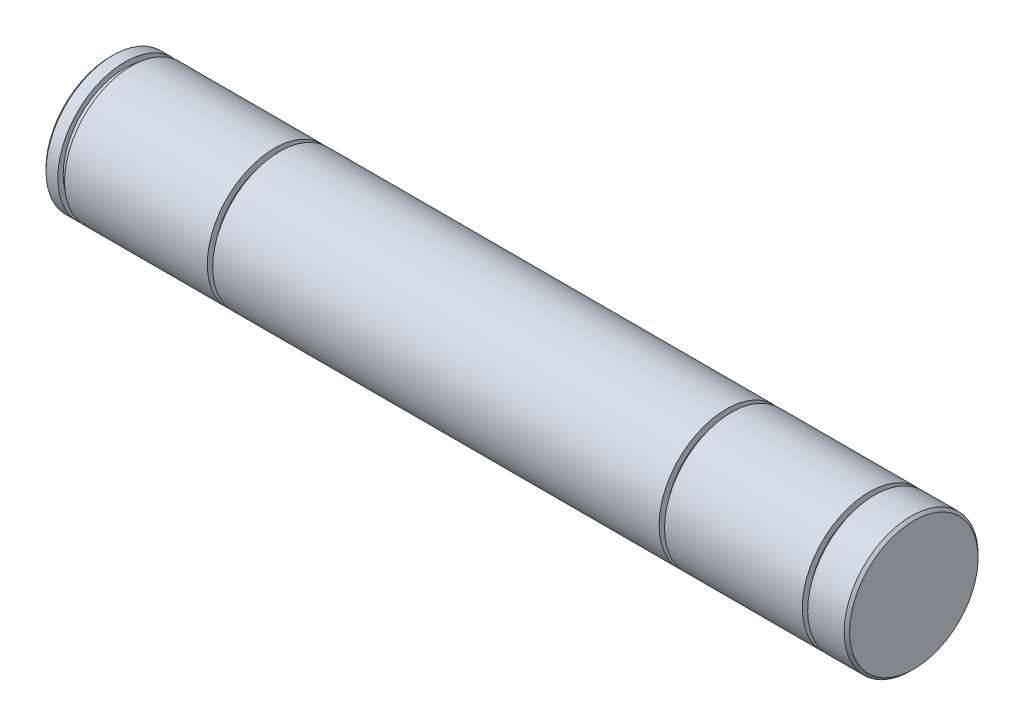
ISO-10303-21;
HEADER;
FILE_DESCRIPTION(('STEP AP214'),'2;1');
FILE_NAME('part.step','',(''),(''),'','','');
FILE_SCHEMA(('AUTOMOTIVE_DESIGN { 1 0 10303 214 1 1 1 1 }'));
ENDSEC;
DATA;
#1=APPLICATION_CONTEXT('core data for automotive mechanical design processes');
#2=APPLICATION_PROTOCOL_DEFINITION('international standard','automotive_design',2000,#1);
#3=PRODUCT_CONTEXT('',#1,'mechanical');
#4=PRODUCT('Part','Part','',(#3));
#5=PRODUCT_RELATED_PRODUCT_CATEGORY('part','',(#4));
#6=PRODUCT_DEFINITION_FORMATION('','',#4);
#7=PRODUCT_DEFINITION_CONTEXT('part definition',#1,'design');
#8=PRODUCT_DEFINITION('design','',#6,#7);
#9=PRODUCT_DEFINITION_SHAPE('','',#8);
#10=(LENGTH_UNIT() NAMED_UNIT(*) SI_UNIT(.MILLI.,.METRE.));
#11=(NAMED_UNIT(*) PLANE_ANGLE_UNIT() SI_UNIT($,.RADIAN.));
#12=(NAMED_UNIT(*) SI_UNIT($,.STERADIAN.) SOLID_ANGLE_UNIT());
#13=UNCERTAINTY_MEASURE_WITH_UNIT(LENGTH_MEASURE(1.E-05),#10,'distance_accuracy_value','');
#14=(GEOMETRIC_REPRESENTATION_CONTEXT(3) GLOBAL_UNCERTAINTY_ASSIGNED_CONTEXT((#13)) GLOBAL_UNIT_ASSIGNED_CONTEXT((#10,
#11,#12)) REPRESENTATION_CONTEXT('',''));
#15=CARTESIAN_POINT('',(0.,0.,0.));
#16=DIRECTION('',(0.,0.,1.));
#17=DIRECTION('',(1.,0.,0.));
#18=AXIS2_PLACEMENT_3D('',#15,#16,#17);
#19=CARTESIAN_POINT('',(0.,0.,0.));
#20=DIRECTION('',(1.,0.,0.));
#21=DIRECTION('',(0.,0.,-1.));
#22=AXIS2_PLACEMENT_3D('',#19,#20,#21);
#23=PLANE('',#22);
#24=CARTESIAN_POINT('',(0.,0.,0.));
#25=DIRECTION('',(-1.,0.,0.));
#26=DIRECTION('',(0.,0.,1.));
#27=AXIS2_PLACEMENT_3D('',#24,#25,#26);
#28=CIRCLE('',#27,24.);
#29=CARTESIAN_POINT('',(0.,0.,24.));
#30=VERTEX_POINT('',#29);
#31=EDGE_CURVE('E10',#30,#30,#28,.T.);
#32=ORIENTED_EDGE('',*,*,#31,.T.);
#33=EDGE_LOOP('',(#32));
#34=FACE_BOUND('',#33,.T.);
#35=ADVANCED_FACE('F37',(#34),#23,.F.);
#36=CARTESIAN_POINT('',(1.,0.,0.));
#37=DIRECTION('',(1.,0.,0.));
#38=DIRECTION('',(0.,0.,-1.));
#39=AXIS2_PLACEMENT_3D('',#36,#37,#38);
#40=CONICAL_SURFACE('',#39,25.,0.785398163397449);
#41=ORIENTED_EDGE('',*,*,#31,.F.);
#42=EDGE_LOOP('',(#41));
#43=FACE_BOUND('',#42,.T.);
#44=CARTESIAN_POINT('',(1.,0.,0.));
#45=DIRECTION('',(-1.,0.,0.));
#46=DIRECTION('',(0.,0.,1.));
#47=AXIS2_PLACEMENT_3D('',#44,#45,#46);
#48=CIRCLE('',#47,25.);
#49=CARTESIAN_POINT('',(1.,0.,25.));
#50=VERTEX_POINT('',#49);
#51=EDGE_CURVE('E43',#50,#50,#48,.T.);
#52=ORIENTED_EDGE('',*,*,#51,.T.);
#53=EDGE_LOOP('',(#52));
#54=FACE_BOUND('',#53,.T.);
#55=ADVANCED_FACE('F117',(#43,#54),#40,.T.);
#56=CARTESIAN_POINT('',(0.,0.,0.));
#57=DIRECTION('',(-1.,0.,0.));
#58=DIRECTION('',(0.,0.,1.));
#59=AXIS2_PLACEMENT_3D('',#56,#57,#58);
#60=CYLINDRICAL_SURFACE('',#59,25.);
#61=ORIENTED_EDGE('',*,*,#51,.F.);
#62=EDGE_LOOP('',(#61));
#63=FACE_BOUND('',#62,.T.);
#64=CARTESIAN_POINT('',(5.41464310345202,0.,0.));
#65=DIRECTION('',(-1.,0.,0.));
#66=DIRECTION('',(0.,0.,1.));
#67=AXIS2_PLACEMENT_3D('',#64,#65,#66);
#68=CIRCLE('',#67,25.);
#69=CARTESIAN_POINT('',(5.41464310345202,0.,25.));
#70=VERTEX_POINT('',#69);
#71=EDGE_CURVE('E47',#70,#70,#68,.T.);
#72=ORIENTED_EDGE('',*,*,#71,.T.);
#73=EDGE_LOOP('',(#72));
#74=FACE_BOUND('',#73,.T.);
#75=ADVANCED_FACE('F121',(#63,#74),#60,.T.);
#76=CARTESIAN_POINT('',(5.41464310345202,25.,0.));
#77=DIRECTION('',(-1.,0.,0.));
#78=DIRECTION('',(0.,0.,1.));
#79=AXIS2_PLACEMENT_3D('',#76,#77,#78);
#80=PLANE('',#79);
#81=ORIENTED_EDGE('',*,*,#71,.F.);
#82=EDGE_LOOP('',(#81));
#83=FACE_BOUND('',#82,.T.);
#84=CARTESIAN_POINT('',(5.41464310345202,0.,0.));
#85=DIRECTION('',(-1.,0.,0.));
#86=DIRECTION('',(0.,0.,1.));
#87=AXIS2_PLACEMENT_3D('',#84,#85,#86);
#88=CIRCLE('',#87,23.);
#89=CARTESIAN_POINT('',(5.41464310345202,0.,23.));
#90=VERTEX_POINT('',#89);
#91=EDGE_CURVE('E51',#90,#90,#88,.T.);
#92=ORIENTED_EDGE('',*,*,#91,.T.);
#93=EDGE_LOOP('',(#92));
#94=FACE_BOUND('',#93,.T.);
#95=ADVANCED_FACE('F126',(#83,#94),#80,.F.);
#96=CARTESIAN_POINT('',(0.,0.,0.));
#97=DIRECTION('',(-1.,0.,0.));
#98=DIRECTION('',(0.,0.,1.));
#99=AXIS2_PLACEMENT_3D('',#96,#97,#98);
#100=CYLINDRICAL_SURFACE('',#99,23.);
#101=ORIENTED_EDGE('',*,*,#91,.F.);
#102=EDGE_LOOP('',(#101));
#103=FACE_BOUND('',#102,.T.);
#104=CARTESIAN_POINT('',(7.91464310345202,0.,0.));
#105=DIRECTION('',(-1.,0.,0.));
#106=DIRECTION('',(0.,0.,1.));
#107=AXIS2_PLACEMENT_3D('',#104,#105,#106);
#108=CIRCLE('',#107,23.);
#109=CARTESIAN_POINT('',(7.91464310345202,0.,23.));
#110=VERTEX_POINT('',#109);
#111=EDGE_CURVE('E56',#110,#110,#108,.T.);
#112=ORIENTED_EDGE('',*,*,#111,.T.);
#113=EDGE_LOOP('',(#112));
#114=FACE_BOUND('',#113,.T.);
#115=ADVANCED_FACE('F132',(#103,#114),#100,.T.);
#116=CARTESIAN_POINT('',(7.91464310345202,23.,0.));
#117=DIRECTION('',(1.,0.,0.));
#118=DIRECTION('',(0.,0.,-1.));
#119=AXIS2_PLACEMENT_3D('',#116,#117,#118);
#120=PLANE('',#119);
#121=ORIENTED_EDGE('',*,*,#111,.F.);
#122=EDGE_LOOP('',(#121));
#123=FACE_BOUND('',#122,.T.);
#124=CARTESIAN_POINT('',(7.91464310345202,0.,0.));
#125=DIRECTION('',(-1.,0.,0.));
#126=DIRECTION('',(0.,0.,1.));
#127=AXIS2_PLACEMENT_3D('',#124,#125,#126);
#128=CIRCLE('',#127,25.);
#129=CARTESIAN_POINT('',(7.91464310345202,0.,25.));
#130=VERTEX_POINT('',#129);
#131=EDGE_CURVE('E59',#130,#130,#128,.T.);
#132=ORIENTED_EDGE('',*,*,#131,.T.);
#133=EDGE_LOOP('',(#132));
#134=FACE_BOUND('',#133,.T.);
#135=ADVANCED_FACE('F136',(#123,#134),#120,.F.);
#136=CARTESIAN_POINT('',(0.,0.,0.));
#137=DIRECTION('',(-1.,0.,0.));
#138=DIRECTION('',(0.,0.,1.));
#139=AXIS2_PLACEMENT_3D('',#136,#137,#138);
#140=CYLINDRICAL_SURFACE('',#139,25.);
#141=ORIENTED_EDGE('',*,*,#131,.F.);
#142=EDGE_LOOP('',(#141));
#143=FACE_BOUND('',#142,.T.);
#144=CARTESIAN_POINT('',(61.2199006760505,0.,0.));
#145=DIRECTION('',(-1.,0.,0.));
#146=DIRECTION('',(0.,0.,1.));
#147=AXIS2_PLACEMENT_3D('',#144,#145,#146);
#148=CIRCLE('',#147,25.);
#149=CARTESIAN_POINT('',(61.2199006760505,0.,25.));
#150=VERTEX_POINT('',#149);
#151=EDGE_CURVE('E62',#150,#150,#148,.T.);
#152=ORIENTED_EDGE('',*,*,#151,.T.);
#153=EDGE_LOOP('',(#152));
#154=FACE_BOUND('',#153,.T.);
#155=ADVANCED_FACE('F140',(#143,#154),#140,.T.);
#156=CARTESIAN_POINT('',(61.2199006760505,25.,0.));
#157=DIRECTION('',(-1.,0.,0.));
#158=DIRECTION('',(0.,0.,1.));
#159=AXIS2_PLACEMENT_3D('',#156,#157,#158);
#160=PLANE('',#159);
#161=ORIENTED_EDGE('',*,*,#151,.F.);
#162=EDGE_LOOP('',(#161));
#163=FACE_BOUND('',#162,.T.);
#164=CARTESIAN_POINT('',(61.2199006760505,0.,0.));
#165=DIRECTION('',(-1.,0.,0.));
#166=DIRECTION('',(0.,0.,1.));
#167=AXIS2_PLACEMENT_3D('',#164,#165,#166);
#168=CIRCLE('',#167,22.5);
#169=CARTESIAN_POINT('',(61.2199006760505,0.,22.5));
#170=VERTEX_POINT('',#169);
#171=EDGE_CURVE('E65',#170,#170,#168,.T.);
#172=ORIENTED_EDGE('',*,*,#171,.T.);
#173=EDGE_LOOP('',(#172));
#174=FACE_BOUND('',#173,.T.);
#175=ADVANCED_FACE('F144',(#163,#174),#160,.F.);
#176=CARTESIAN_POINT('',(0.,0.,0.));
#177=DIRECTION('',(-1.,0.,0.));
#178=DIRECTION('',(0.,0.,1.));
#179=AXIS2_PLACEMENT_3D('',#176,#177,#178);
#180=CYLINDRICAL_SURFACE('',#179,22.5);
#181=ORIENTED_EDGE('',*,*,#171,.F.);
#182=EDGE_LOOP('',(#181));
#183=FACE_BOUND('',#182,.T.);
#184=CARTESIAN_POINT('',(63.2199006760505,0.,0.));
#185=DIRECTION('',(-1.,0.,0.));
#186=DIRECTION('',(0.,0.,1.));
#187=AXIS2_PLACEMENT_3D('',#184,#185,#186);
#188=CIRCLE('',#187,22.5);
#189=CARTESIAN_POINT('',(63.2199006760505,0.,22.5));
#190=VERTEX_POINT('',#189);
#191=EDGE_CURVE('E68',#190,#190,#188,.T.);
#192=ORIENTED_EDGE('',*,*,#191,.T.);
#193=EDGE_LOOP('',(#192));
#194=FACE_BOUND('',#193,.T.);
#195=ADVANCED_FACE('F148',(#183,#194),#180,.T.);
#196=CARTESIAN_POINT('',(63.2199006760505,22.5,0.));
#197=DIRECTION('',(1.,0.,0.));
#198=DIRECTION('',(0.,0.,-1.));
#199=AXIS2_PLACEMENT_3D('',#196,#197,#198);
#200=PLANE('',#199);
#201=ORIENTED_EDGE('',*,*,#191,.F.);
#202=EDGE_LOOP('',(#201));
#203=FACE_BOUND('',#202,.T.);
#204=CARTESIAN_POINT('',(63.2199006760505,0.,0.));
#205=DIRECTION('',(-1.,0.,0.));
#206=DIRECTION('',(0.,0.,1.));
#207=AXIS2_PLACEMENT_3D('',#204,#205,#206);
#208=CIRCLE('',#207,25.);
#209=CARTESIAN_POINT('',(63.2199006760505,0.,25.));
#210=VERTEX_POINT('',#209);
#211=EDGE_CURVE('E71',#210,#210,#208,.T.);
#212=ORIENTED_EDGE('',*,*,#211,.T.);
#213=EDGE_LOOP('',(#212));
#214=FACE_BOUND('',#213,.T.);
#215=ADVANCED_FACE('F152',(#203,#214),#200,.F.);
#216=CARTESIAN_POINT('',(0.,0.,0.));
#217=DIRECTION('',(-1.,0.,0.));
#218=DIRECTION('',(0.,0.,1.));
#219=AXIS2_PLACEMENT_3D('',#216,#217,#218);
#220=CYLINDRICAL_SURFACE('',#219,25.);
#221=ORIENTED_EDGE('',*,*,#211,.F.);
#222=EDGE_LOOP('',(#221));
#223=FACE_BOUND('',#222,.T.);
#224=CARTESIAN_POINT('',(229.910129711499,0.,0.));
#225=DIRECTION('',(-1.,0.,0.));
#226=DIRECTION('',(0.,0.,1.));
#227=AXIS2_PLACEMENT_3D('',#224,#225,#226);
#228=CIRCLE('',#227,25.);
#229=CARTESIAN_POINT('',(229.910129711499,0.,25.));
#230=VERTEX_POINT('',#229);
#231=EDGE_CURVE('E74',#230,#230,#228,.T.);
#232=ORIENTED_EDGE('',*,*,#231,.T.);
#233=EDGE_LOOP('',(#232));
#234=FACE_BOUND('',#233,.T.);
#235=ADVANCED_FACE('F156',(#223,#234),#220,.T.);
#236=CARTESIAN_POINT('',(229.910129711499,25.,0.));
#237=DIRECTION('',(-1.,0.,0.));
#238=DIRECTION('',(0.,0.,1.));
#239=AXIS2_PLACEMENT_3D('',#236,#237,#238);
#240=PLANE('',#239);
#241=ORIENTED_EDGE('',*,*,#231,.F.);
#242=EDGE_LOOP('',(#241));
#243=FACE_BOUND('',#242,.T.);
#244=CARTESIAN_POINT('',(229.910129711499,0.,0.));
#245=DIRECTION('',(-1.,0.,0.));
#246=DIRECTION('',(0.,0.,1.));
#247=AXIS2_PLACEMENT_3D('',#244,#245,#246);
#248=CIRCLE('',#247,22.5);
#249=CARTESIAN_POINT('',(229.910129711499,0.,22.5));
#250=VERTEX_POINT('',#249);
#251=EDGE_CURVE('E77',#250,#250,#248,.T.);
#252=ORIENTED_EDGE('',*,*,#251,.T.);
#253=EDGE_LOOP('',(#252));
#254=FACE_BOUND('',#253,.T.);
#255=ADVANCED_FACE('F160',(#243,#254),#240,.F.);
#256=CARTESIAN_POINT('',(0.,0.,0.));
#257=DIRECTION('',(-1.,0.,0.));
#258=DIRECTION('',(0.,0.,1.));
#259=AXIS2_PLACEMENT_3D('',#256,#257,#258);
#260=CYLINDRICAL_SURFACE('',#259,22.5);
#261=ORIENTED_EDGE('',*,*,#251,.F.);
#262=EDGE_LOOP('',(#261));
#263=FACE_BOUND('',#262,.T.);
#264=CARTESIAN_POINT('',(231.910129711499,0.,0.));
#265=DIRECTION('',(-1.,0.,0.));
#266=DIRECTION('',(0.,0.,1.));
#267=AXIS2_PLACEMENT_3D('',#264,#265,#266);
#268=CIRCLE('',#267,22.5);
#269=CARTESIAN_POINT('',(231.910129711499,0.,22.5));
#270=VERTEX_POINT('',#269);
#271=EDGE_CURVE('E80',#270,#270,#268,.T.);
#272=ORIENTED_EDGE('',*,*,#271,.T.);
#273=EDGE_LOOP('',(#272));
#274=FACE_BOUND('',#273,.T.);
#275=ADVANCED_FACE('F164',(#263,#274),#260,.T.);
#276=CARTESIAN_POINT('',(231.910129711499,22.5,0.));
#277=DIRECTION('',(1.,0.,0.));
#278=DIRECTION('',(0.,0.,-1.));
#279=AXIS2_PLACEMENT_3D('',#276,#277,#278);
#280=PLANE('',#279);
#281=ORIENTED_EDGE('',*,*,#271,.F.);
#282=EDGE_LOOP('',(#281));
#283=FACE_BOUND('',#282,.T.);
#284=CARTESIAN_POINT('',(231.910129711499,0.,0.));
#285=DIRECTION('',(-1.,0.,0.));
#286=DIRECTION('',(0.,0.,1.));
#287=AXIS2_PLACEMENT_3D('',#284,#285,#286);
#288=CIRCLE('',#287,25.);
#289=CARTESIAN_POINT('',(231.910129711499,0.,25.));
#290=VERTEX_POINT('',#289);
#291=EDGE_CURVE('E83',#290,#290,#288,.T.);
#292=ORIENTED_EDGE('',*,*,#291,.T.);
#293=EDGE_LOOP('',(#292));
#294=FACE_BOUND('',#293,.T.);
#295=ADVANCED_FACE('F168',(#283,#294),#280,.F.);
#296=CARTESIAN_POINT('',(0.,0.,0.));
#297=DIRECTION('',(-1.,0.,0.));
#298=DIRECTION('',(0.,0.,1.));
#299=AXIS2_PLACEMENT_3D('',#296,#297,#298);
#300=CYLINDRICAL_SURFACE('',#299,25.);
#301=ORIENTED_EDGE('',*,*,#291,.F.);
#302=EDGE_LOOP('',(#301));
#303=FACE_BOUND('',#302,.T.);
#304=CARTESIAN_POINT('',(283.363331023821,0.,0.));
#305=DIRECTION('',(-1.,0.,0.));
#306=DIRECTION('',(0.,0.,1.));
#307=AXIS2_PLACEMENT_3D('',#304,#305,#306);
#308=CIRCLE('',#307,25.);
#309=CARTESIAN_POINT('',(283.363331023821,0.,25.));
#310=VERTEX_POINT('',#309);
#311=EDGE_CURVE('E86',#310,#310,#308,.T.);
#312=ORIENTED_EDGE('',*,*,#311,.T.);
#313=EDGE_LOOP('',(#312));
#314=FACE_BOUND('',#313,.T.);
#315=ADVANCED_FACE('F172',(#303,#314),#300,.T.);
#316=CARTESIAN_POINT('',(283.363331023821,25.,0.));
#317=DIRECTION('',(-1.,0.,0.));
#318=DIRECTION('',(0.,0.,1.));
#319=AXIS2_PLACEMENT_3D('',#316,#317,#318);
#320=PLANE('',#319);
#321=ORIENTED_EDGE('',*,*,#311,.F.);
#322=EDGE_LOOP('',(#321));
#323=FACE_BOUND('',#322,.T.);
#324=CARTESIAN_POINT('',(283.363331023821,0.,0.));
#325=DIRECTION('',(-1.,0.,0.));
#326=DIRECTION('',(0.,0.,1.));
#327=AXIS2_PLACEMENT_3D('',#324,#325,#326);
#328=CIRCLE('',#327,22.5);
#329=CARTESIAN_POINT('',(283.363331023821,0.,22.5));
#330=VERTEX_POINT('',#329);
#331=EDGE_CURVE('E89',#330,#330,#328,.T.);
#332=ORIENTED_EDGE('',*,*,#331,.T.);
#333=EDGE_LOOP('',(#332));
#334=FACE_BOUND('',#333,.T.);
#335=ADVANCED_FACE('F176',(#323,#334),#320,.F.);
#336=CARTESIAN_POINT('',(0.,0.,0.));
#337=DIRECTION('',(-1.,0.,0.));
#338=DIRECTION('',(0.,0.,1.));
#339=AXIS2_PLACEMENT_3D('',#336,#337,#338);
#340=CYLINDRICAL_SURFACE('',#339,22.5);
#341=ORIENTED_EDGE('',*,*,#331,.F.);
#342=EDGE_LOOP('',(#341));
#343=FACE_BOUND('',#342,.T.);
#344=CARTESIAN_POINT('',(285.363331023821,0.,0.));
#345=DIRECTION('',(-1.,0.,0.));
#346=DIRECTION('',(0.,0.,1.));
#347=AXIS2_PLACEMENT_3D('',#344,#345,#346);
#348=CIRCLE('',#347,22.5);
#349=CARTESIAN_POINT('',(285.363331023821,0.,22.5));
#350=VERTEX_POINT('',#349);
#351=EDGE_CURVE('E92',#350,#350,#348,.T.);
#352=ORIENTED_EDGE('',*,*,#351,.T.);
#353=EDGE_LOOP('',(#352));
#354=FACE_BOUND('',#353,.T.);
#355=ADVANCED_FACE('F180',(#343,#354),#340,.T.);
#356=CARTESIAN_POINT('',(285.363331023821,22.5,0.));
#357=DIRECTION('',(1.,0.,0.));
#358=DIRECTION('',(0.,0.,-1.));
#359=AXIS2_PLACEMENT_3D('',#356,#357,#358);
#360=PLANE('',#359);
#361=ORIENTED_EDGE('',*,*,#351,.F.);
#362=EDGE_LOOP('',(#361));
#363=FACE_BOUND('',#362,.T.);
#364=CARTESIAN_POINT('',(285.363331023821,0.,0.));
#365=DIRECTION('',(-1.,0.,0.));
#366=DIRECTION('',(0.,0.,1.));
#367=AXIS2_PLACEMENT_3D('',#364,#365,#366);
#368=CIRCLE('',#367,25.);
#369=CARTESIAN_POINT('',(285.363331023821,0.,25.));
#370=VERTEX_POINT('',#369);
#371=EDGE_CURVE('E95',#370,#370,#368,.T.);
#372=ORIENTED_EDGE('',*,*,#371,.T.);
#373=EDGE_LOOP('',(#372));
#374=FACE_BOUND('',#373,.T.);
#375=ADVANCED_FACE('F184',(#363,#374),#360,.F.);
#376=CARTESIAN_POINT('',(0.,0.,0.));
#377=DIRECTION('',(-1.,0.,0.));
#378=DIRECTION('',(0.,0.,1.));
#379=AXIS2_PLACEMENT_3D('',#376,#377,#378);
#380=CYLINDRICAL_SURFACE('',#379,25.);
#381=ORIENTED_EDGE('',*,*,#371,.F.);
#382=EDGE_LOOP('',(#381));
#383=FACE_BOUND('',#382,.T.);
#384=CARTESIAN_POINT('',(299.,0.,0.));
#385=DIRECTION('',(-1.,0.,0.));
#386=DIRECTION('',(0.,0.,1.));
#387=AXIS2_PLACEMENT_3D('',#384,#385,#386);
#388=CIRCLE('',#387,25.);
#389=CARTESIAN_POINT('',(299.,0.,25.));
#390=VERTEX_POINT('',#389);
#391=EDGE_CURVE('E98',#390,#390,#388,.T.);
#392=ORIENTED_EDGE('',*,*,#391,.T.);
#393=EDGE_LOOP('',(#392));
#394=FACE_BOUND('',#393,.T.);
#395=ADVANCED_FACE('F113',(#383,#394),#380,.T.);
#396=CARTESIAN_POINT('',(300.,0.,0.));
#397=DIRECTION('',(-1.,0.,0.));
#398=DIRECTION('',(0.,0.,1.));
#399=AXIS2_PLACEMENT_3D('',#396,#397,#398);
#400=CONICAL_SURFACE('',#399,24.,0.78539816339745);
#401=ORIENTED_EDGE('',*,*,#391,.F.);
#402=EDGE_LOOP('',(#401));
#403=FACE_BOUND('',#402,.T.);
#404=CARTESIAN_POINT('',(300.,0.,0.));
#405=DIRECTION('',(-1.,0.,0.));
#406=DIRECTION('',(0.,0.,1.));
#407=AXIS2_PLACEMENT_3D('',#404,#405,#406);
#408=CIRCLE('',#407,24.);
#409=CARTESIAN_POINT('',(300.,0.,24.));
#410=VERTEX_POINT('',#409);
#411=EDGE_CURVE('E101',#410,#410,#408,.T.);
#412=ORIENTED_EDGE('',*,*,#411,.T.);
#413=EDGE_LOOP('',(#412));
#414=FACE_BOUND('',#413,.T.);
#415=ADVANCED_FACE('F105',(#403,#414),#400,.T.);
#416=CARTESIAN_POINT('',(300.,24.,0.));
#417=DIRECTION('',(-1.,0.,0.));
#418=DIRECTION('',(0.,0.,1.));
#419=AXIS2_PLACEMENT_3D('',#416,#417,#418);
#420=PLANE('',#419);
#421=ORIENTED_EDGE('',*,*,#411,.F.);
#422=EDGE_LOOP('',(#421));
#423=FACE_BOUND('',#422,.T.);
#424=ADVANCED_FACE('F107',(#423),#420,.F.);
#425=CLOSED_SHELL('',(#35,#55,#75,#95,#115,#135,#155,#175,#195,#215,#235,#255,#275,#295,#315,
#335,#355,#375,#395,#415,#424));
#426=MANIFOLD_SOLID_BREP('B2',#425);
#427=ADVANCED_BREP_SHAPE_REPRESENTATION('',(#18,#426),#14);
#428=SHAPE_DEFINITION_REPRESENTATION(#9,#427);
ENDSEC;
END-ISO-10303-21;
